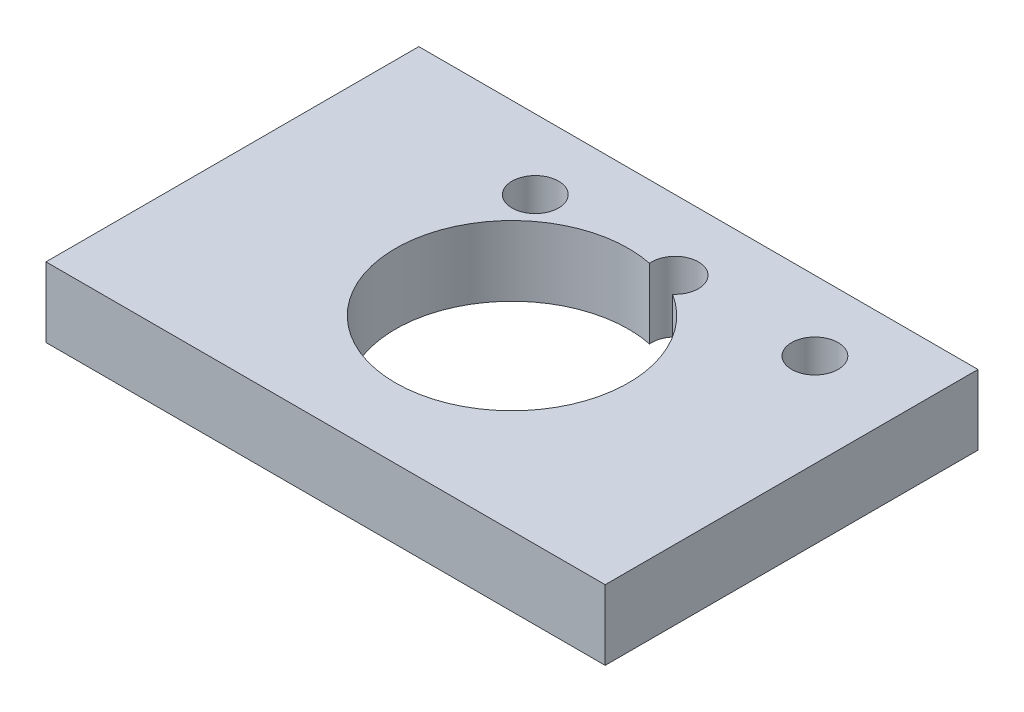
ISO-10303-21;
HEADER;
FILE_DESCRIPTION(('STEP AP214'),'2;1');
FILE_NAME('part.step','',(''),(''),'','','');
FILE_SCHEMA(('AUTOMOTIVE_DESIGN { 1 0 10303 214 1 1 1 1 }'));
ENDSEC;
DATA;
#1=APPLICATION_CONTEXT('core data for automotive mechanical design processes');
#2=APPLICATION_PROTOCOL_DEFINITION('international standard','automotive_design',2000,#1);
#3=PRODUCT_CONTEXT('',#1,'mechanical');
#4=PRODUCT('Part','Part','',(#3));
#5=PRODUCT_RELATED_PRODUCT_CATEGORY('part','',(#4));
#6=PRODUCT_DEFINITION_FORMATION('','',#4);
#7=PRODUCT_DEFINITION_CONTEXT('part definition',#1,'design');
#8=PRODUCT_DEFINITION('design','',#6,#7);
#9=PRODUCT_DEFINITION_SHAPE('','',#8);
#10=(LENGTH_UNIT() NAMED_UNIT(*) SI_UNIT(.MILLI.,.METRE.));
#11=(NAMED_UNIT(*) PLANE_ANGLE_UNIT() SI_UNIT($,.RADIAN.));
#12=(NAMED_UNIT(*) SI_UNIT($,.STERADIAN.) SOLID_ANGLE_UNIT());
#13=UNCERTAINTY_MEASURE_WITH_UNIT(LENGTH_MEASURE(1.E-05),#10,'distance_accuracy_value','');
#14=(GEOMETRIC_REPRESENTATION_CONTEXT(3) GLOBAL_UNCERTAINTY_ASSIGNED_CONTEXT((#13)) GLOBAL_UNIT_ASSIGNED_CONTEXT((#10,
#11,#12)) REPRESENTATION_CONTEXT('',''));
#15=CARTESIAN_POINT('',(0.,0.,0.));
#16=DIRECTION('',(0.,0.,1.));
#17=DIRECTION('',(1.,0.,0.));
#18=AXIS2_PLACEMENT_3D('',#15,#16,#17);
#19=CARTESIAN_POINT('',(0.,15.,0.));
#20=DIRECTION('',(0.,-1.,0.));
#21=DIRECTION('',(0.,0.,-1.));
#22=AXIS2_PLACEMENT_3D('',#19,#20,#21);
#23=CYLINDRICAL_SURFACE('',#22,25.);
#24=CARTESIAN_POINT('',(0.,15.,0.));
#25=DIRECTION('',(0.,1.,0.));
#26=DIRECTION('',(0.,0.,1.));
#27=AXIS2_PLACEMENT_3D('',#24,#25,#26);
#28=CIRCLE('',#27,25.);
#29=CARTESIAN_POINT('',(5.02612413182352,15.,-24.4895503472706));
#30=VERTEX_POINT('',#29);
#31=CARTESIAN_POINT('',(13.249737937142,15.,-21.2001048251432));
#32=VERTEX_POINT('',#31);
#33=EDGE_CURVE('E112',#30,#32,#28,.T.);
#34=ORIENTED_EDGE('',*,*,#33,.T.);
#35=DIRECTION('',(0.,-1.,0.));
#36=VECTOR('',#35,1.);
#37=CARTESIAN_POINT('',(13.249737937142,7.5,-21.2001048251432));
#38=LINE('',#37,#36);
#39=CARTESIAN_POINT('',(13.249737937142,0.,-21.2001048251432));
#40=VERTEX_POINT('',#39);
#41=EDGE_CURVE('E11',#32,#40,#38,.T.);
#42=ORIENTED_EDGE('',*,*,#41,.T.);
#43=CARTESIAN_POINT('',(0.,0.,0.));
#44=DIRECTION('',(0.,1.,0.));
#45=DIRECTION('',(0.,0.,1.));
#46=AXIS2_PLACEMENT_3D('',#43,#44,#45);
#47=CIRCLE('',#46,25.);
#48=CARTESIAN_POINT('',(5.02612413182352,0.,-24.4895503472706));
#49=VERTEX_POINT('',#48);
#50=EDGE_CURVE('E108',#49,#40,#47,.T.);
#51=ORIENTED_EDGE('',*,*,#50,.F.);
#52=DIRECTION('',(0.,-1.,0.));
#53=VECTOR('',#52,1.);
#54=CARTESIAN_POINT('',(5.02612413182352,7.5,-24.4895503472706));
#55=LINE('',#54,#53);
#56=EDGE_CURVE('E50',#49,#30,#55,.F.);
#57=ORIENTED_EDGE('',*,*,#56,.T.);
#58=EDGE_LOOP('',(#34,#42,#51,#57));
#59=FACE_BOUND('',#58,.T.);
#60=ADVANCED_FACE('F39',(#59),#23,.F.);
#61=CARTESIAN_POINT('',(-60.,15.,40.));
#62=DIRECTION('',(1.,0.,0.));
#63=DIRECTION('',(0.,0.,-1.));
#64=AXIS2_PLACEMENT_3D('',#61,#62,#63);
#65=PLANE('',#64);
#66=DIRECTION('',(0.,0.,1.));
#67=VECTOR('',#66,1.);
#68=CARTESIAN_POINT('',(-60.,0.,40.));
#69=LINE('',#68,#67);
#70=CARTESIAN_POINT('',(-60.,0.,-40.));
#71=VERTEX_POINT('',#70);
#72=CARTESIAN_POINT('',(-60.,0.,40.));
#73=VERTEX_POINT('',#72);
#74=EDGE_CURVE('E118',#71,#73,#69,.T.);
#75=ORIENTED_EDGE('',*,*,#74,.T.);
#76=DIRECTION('',(0.,-1.,0.));
#77=VECTOR('',#76,1.);
#78=CARTESIAN_POINT('',(-60.,15.,40.));
#79=LINE('',#78,#77);
#80=CARTESIAN_POINT('',(-60.,15.,40.));
#81=VERTEX_POINT('',#80);
#82=EDGE_CURVE('E141',#81,#73,#79,.T.);
#83=ORIENTED_EDGE('',*,*,#82,.F.);
#84=DIRECTION('',(0.,0.,1.));
#85=VECTOR('',#84,1.);
#86=CARTESIAN_POINT('',(-60.,15.,40.));
#87=LINE('',#86,#85);
#88=CARTESIAN_POINT('',(-60.,15.,-40.));
#89=VERTEX_POINT('',#88);
#90=EDGE_CURVE('E124',#89,#81,#87,.T.);
#91=ORIENTED_EDGE('',*,*,#90,.F.);
#92=DIRECTION('',(0.,-1.,0.));
#93=VECTOR('',#92,1.);
#94=CARTESIAN_POINT('',(-60.,15.,-40.));
#95=LINE('',#94,#93);
#96=EDGE_CURVE('E129',#89,#71,#95,.T.);
#97=ORIENTED_EDGE('',*,*,#96,.T.);
#98=EDGE_LOOP('',(#75,#83,#91,#97));
#99=FACE_BOUND('',#98,.T.);
#100=ADVANCED_FACE('F41',(#99),#65,.F.);
#101=CARTESIAN_POINT('',(-60.,15.,40.));
#102=DIRECTION('',(0.,0.,-1.));
#103=DIRECTION('',(-1.,0.,0.));
#104=AXIS2_PLACEMENT_3D('',#101,#102,#103);
#105=PLANE('',#104);
#106=DIRECTION('',(1.,0.,0.));
#107=VECTOR('',#106,1.);
#108=CARTESIAN_POINT('',(-60.,0.,40.));
#109=LINE('',#108,#107);
#110=CARTESIAN_POINT('',(60.,0.,40.));
#111=VERTEX_POINT('',#110);
#112=EDGE_CURVE('E134',#73,#111,#109,.T.);
#113=ORIENTED_EDGE('',*,*,#112,.T.);
#114=DIRECTION('',(0.,-1.,0.));
#115=VECTOR('',#114,1.);
#116=CARTESIAN_POINT('',(60.,15.,40.));
#117=LINE('',#116,#115);
#118=CARTESIAN_POINT('',(60.,15.,40.));
#119=VERTEX_POINT('',#118);
#120=EDGE_CURVE('E140',#119,#111,#117,.T.);
#121=ORIENTED_EDGE('',*,*,#120,.F.);
#122=DIRECTION('',(1.,0.,0.));
#123=VECTOR('',#122,1.);
#124=CARTESIAN_POINT('',(-60.,15.,40.));
#125=LINE('',#124,#123);
#126=EDGE_CURVE('E95',#81,#119,#125,.T.);
#127=ORIENTED_EDGE('',*,*,#126,.F.);
#128=ORIENTED_EDGE('',*,*,#82,.T.);
#129=EDGE_LOOP('',(#113,#121,#127,#128));
#130=FACE_BOUND('',#129,.T.);
#131=ADVANCED_FACE('F171',(#130),#105,.F.);
#132=CARTESIAN_POINT('',(60.,15.,40.));
#133=DIRECTION('',(-1.,0.,0.));
#134=DIRECTION('',(0.,0.,1.));
#135=AXIS2_PLACEMENT_3D('',#132,#133,#134);
#136=PLANE('',#135);
#137=DIRECTION('',(0.,0.,-1.));
#138=VECTOR('',#137,1.);
#139=CARTESIAN_POINT('',(60.,0.,40.));
#140=LINE('',#139,#138);
#141=CARTESIAN_POINT('',(60.,0.,-40.));
#142=VERTEX_POINT('',#141);
#143=EDGE_CURVE('E135',#111,#142,#140,.T.);
#144=ORIENTED_EDGE('',*,*,#143,.T.);
#145=DIRECTION('',(0.,-1.,0.));
#146=VECTOR('',#145,1.);
#147=CARTESIAN_POINT('',(60.,15.,-40.));
#148=LINE('',#147,#146);
#149=CARTESIAN_POINT('',(60.,15.,-40.));
#150=VERTEX_POINT('',#149);
#151=EDGE_CURVE('E139',#150,#142,#148,.T.);
#152=ORIENTED_EDGE('',*,*,#151,.F.);
#153=DIRECTION('',(0.,0.,-1.));
#154=VECTOR('',#153,1.);
#155=CARTESIAN_POINT('',(60.,15.,40.));
#156=LINE('',#155,#154);
#157=EDGE_CURVE('E127',#119,#150,#156,.T.);
#158=ORIENTED_EDGE('',*,*,#157,.F.);
#159=ORIENTED_EDGE('',*,*,#120,.T.);
#160=EDGE_LOOP('',(#144,#152,#158,#159));
#161=FACE_BOUND('',#160,.T.);
#162=ADVANCED_FACE('F184',(#161),#136,.F.);
#163=CARTESIAN_POINT('',(-60.,15.,-40.));
#164=DIRECTION('',(0.,0.,1.));
#165=DIRECTION('',(1.,0.,0.));
#166=AXIS2_PLACEMENT_3D('',#163,#164,#165);
#167=PLANE('',#166);
#168=DIRECTION('',(-1.,0.,0.));
#169=VECTOR('',#168,1.);
#170=CARTESIAN_POINT('',(-60.,0.,-40.));
#171=LINE('',#170,#169);
#172=EDGE_CURVE('E83',#142,#71,#171,.T.);
#173=ORIENTED_EDGE('',*,*,#172,.T.);
#174=ORIENTED_EDGE('',*,*,#96,.F.);
#175=DIRECTION('',(-1.,0.,0.));
#176=VECTOR('',#175,1.);
#177=CARTESIAN_POINT('',(-60.,15.,-40.));
#178=LINE('',#177,#176);
#179=EDGE_CURVE('E62',#150,#89,#178,.T.);
#180=ORIENTED_EDGE('',*,*,#179,.F.);
#181=ORIENTED_EDGE('',*,*,#151,.T.);
#182=EDGE_LOOP('',(#173,#174,#180,#181));
#183=FACE_BOUND('',#182,.T.);
#184=ADVANCED_FACE('F178',(#183),#167,.F.);
#185=CARTESIAN_POINT('',(0.,15.,0.));
#186=DIRECTION('',(0.,-1.,0.));
#187=DIRECTION('',(0.,0.,-1.));
#188=AXIS2_PLACEMENT_3D('',#185,#186,#187);
#189=PLANE('',#188);
#190=CARTESIAN_POINT('',(10.,15.,-25.));
#191=DIRECTION('',(0.,1.,0.));
#192=DIRECTION('',(0.,0.,1.));
#193=AXIS2_PLACEMENT_3D('',#190,#191,#192);
#194=CIRCLE('',#193,5.);
#195=EDGE_CURVE('E53',#32,#30,#194,.T.);
#196=ORIENTED_EDGE('',*,*,#195,.F.);
#197=ORIENTED_EDGE('',*,*,#33,.F.);
#198=EDGE_LOOP('',(#196,#197));
#199=FACE_BOUND('',#198,.T.);
#200=CARTESIAN_POINT('',(-20.,15.,-25.));
#201=DIRECTION('',(0.,1.,0.));
#202=DIRECTION('',(0.,0.,1.));
#203=AXIS2_PLACEMENT_3D('',#200,#201,#202);
#204=CIRCLE('',#203,5.);
#205=CARTESIAN_POINT('',(-20.,15.,-20.));
#206=VERTEX_POINT('',#205);
#207=EDGE_CURVE('E104',#206,#206,#204,.T.);
#208=ORIENTED_EDGE('',*,*,#207,.F.);
#209=EDGE_LOOP('',(#208));
#210=FACE_BOUND('',#209,.T.);
#211=CARTESIAN_POINT('',(40.,15.,-25.));
#212=DIRECTION('',(0.,1.,0.));
#213=DIRECTION('',(0.,0.,1.));
#214=AXIS2_PLACEMENT_3D('',#211,#212,#213);
#215=CIRCLE('',#214,5.);
#216=CARTESIAN_POINT('',(40.,15.,-20.));
#217=VERTEX_POINT('',#216);
#218=EDGE_CURVE('E111',#217,#217,#215,.T.);
#219=ORIENTED_EDGE('',*,*,#218,.F.);
#220=EDGE_LOOP('',(#219));
#221=FACE_BOUND('',#220,.T.);
#222=ORIENTED_EDGE('',*,*,#90,.T.);
#223=ORIENTED_EDGE('',*,*,#126,.T.);
#224=ORIENTED_EDGE('',*,*,#157,.T.);
#225=ORIENTED_EDGE('',*,*,#179,.T.);
#226=EDGE_LOOP('',(#222,#223,#224,#225));
#227=FACE_BOUND('',#226,.T.);
#228=ADVANCED_FACE('F144',(#199,#210,#221,#227),#189,.F.);
#229=CARTESIAN_POINT('',(0.,0.,0.));
#230=DIRECTION('',(0.,-1.,0.));
#231=DIRECTION('',(0.,0.,-1.));
#232=AXIS2_PLACEMENT_3D('',#229,#230,#231);
#233=PLANE('',#232);
#234=CARTESIAN_POINT('',(-20.,0.,-25.));
#235=DIRECTION('',(0.,1.,0.));
#236=DIRECTION('',(0.,0.,1.));
#237=AXIS2_PLACEMENT_3D('',#234,#235,#236);
#238=CIRCLE('',#237,5.);
#239=CARTESIAN_POINT('',(-20.,0.,-20.));
#240=VERTEX_POINT('',#239);
#241=EDGE_CURVE('E155',#240,#240,#238,.T.);
#242=ORIENTED_EDGE('',*,*,#241,.T.);
#243=EDGE_LOOP('',(#242));
#244=FACE_BOUND('',#243,.T.);
#245=CARTESIAN_POINT('',(40.,0.,-25.));
#246=DIRECTION('',(0.,1.,0.));
#247=DIRECTION('',(0.,0.,1.));
#248=AXIS2_PLACEMENT_3D('',#245,#246,#247);
#249=CIRCLE('',#248,5.);
#250=CARTESIAN_POINT('',(40.,0.,-20.));
#251=VERTEX_POINT('',#250);
#252=EDGE_CURVE('E120',#251,#251,#249,.T.);
#253=ORIENTED_EDGE('',*,*,#252,.T.);
#254=EDGE_LOOP('',(#253));
#255=FACE_BOUND('',#254,.T.);
#256=ORIENTED_EDGE('',*,*,#50,.T.);
#257=CARTESIAN_POINT('',(10.,0.,-25.));
#258=DIRECTION('',(0.,1.,0.));
#259=DIRECTION('',(0.,0.,1.));
#260=AXIS2_PLACEMENT_3D('',#257,#258,#259);
#261=CIRCLE('',#260,5.);
#262=EDGE_CURVE('E99',#40,#49,#261,.T.);
#263=ORIENTED_EDGE('',*,*,#262,.T.);
#264=EDGE_LOOP('',(#256,#263));
#265=FACE_BOUND('',#264,.T.);
#266=ORIENTED_EDGE('',*,*,#74,.F.);
#267=ORIENTED_EDGE('',*,*,#172,.F.);
#268=ORIENTED_EDGE('',*,*,#143,.F.);
#269=ORIENTED_EDGE('',*,*,#112,.F.);
#270=EDGE_LOOP('',(#266,#267,#268,#269));
#271=FACE_BOUND('',#270,.T.);
#272=ADVANCED_FACE('F115',(#244,#255,#265,#271),#233,.T.);
#273=CARTESIAN_POINT('',(40.,15.,-25.));
#274=DIRECTION('',(0.,-1.,0.));
#275=DIRECTION('',(0.,0.,-1.));
#276=AXIS2_PLACEMENT_3D('',#273,#274,#275);
#277=CYLINDRICAL_SURFACE('',#276,5.);
#278=ORIENTED_EDGE('',*,*,#218,.T.);
#279=EDGE_LOOP('',(#278));
#280=FACE_BOUND('',#279,.T.);
#281=ORIENTED_EDGE('',*,*,#252,.F.);
#282=EDGE_LOOP('',(#281));
#283=FACE_BOUND('',#282,.T.);
#284=ADVANCED_FACE('F164',(#280,#283),#277,.F.);
#285=CARTESIAN_POINT('',(10.,15.,-25.));
#286=DIRECTION('',(0.,-1.,0.));
#287=DIRECTION('',(0.,0.,-1.));
#288=AXIS2_PLACEMENT_3D('',#285,#286,#287);
#289=CYLINDRICAL_SURFACE('',#288,5.);
#290=ORIENTED_EDGE('',*,*,#195,.T.);
#291=ORIENTED_EDGE('',*,*,#56,.F.);
#292=ORIENTED_EDGE('',*,*,#262,.F.);
#293=ORIENTED_EDGE('',*,*,#41,.F.);
#294=EDGE_LOOP('',(#290,#291,#292,#293));
#295=FACE_BOUND('',#294,.T.);
#296=ADVANCED_FACE('F101',(#295),#289,.F.);
#297=CARTESIAN_POINT('',(-20.,15.,-25.));
#298=DIRECTION('',(0.,-1.,0.));
#299=DIRECTION('',(0.,0.,-1.));
#300=AXIS2_PLACEMENT_3D('',#297,#298,#299);
#301=CYLINDRICAL_SURFACE('',#300,5.);
#302=ORIENTED_EDGE('',*,*,#207,.T.);
#303=EDGE_LOOP('',(#302));
#304=FACE_BOUND('',#303,.T.);
#305=ORIENTED_EDGE('',*,*,#241,.F.);
#306=EDGE_LOOP('',(#305));
#307=FACE_BOUND('',#306,.T.);
#308=ADVANCED_FACE('F158',(#304,#307),#301,.F.);
#309=CLOSED_SHELL('',(#60,#100,#131,#162,#184,#228,#272,#284,#296,#308));
#310=MANIFOLD_SOLID_BREP('B2',#309);
#311=ADVANCED_BREP_SHAPE_REPRESENTATION('',(#18,#310),#14);
#312=SHAPE_DEFINITION_REPRESENTATION(#9,#311);
ENDSEC;
END-ISO-10303-21;
